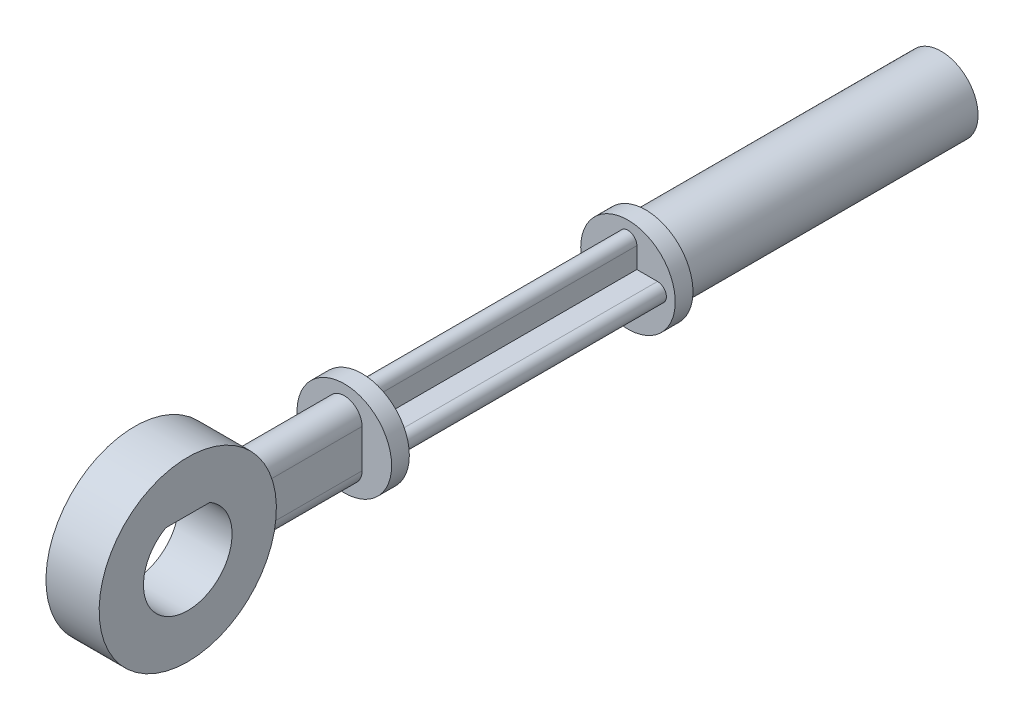
ISO-10303-21;
HEADER;
FILE_DESCRIPTION(('STEP AP214'),'2;1');
FILE_NAME('part.step','',(''),(''),'','','');
FILE_SCHEMA(('AUTOMOTIVE_DESIGN { 1 0 10303 214 1 1 1 1 }'));
ENDSEC;
DATA;
#1=APPLICATION_CONTEXT('core data for automotive mechanical design processes');
#2=APPLICATION_PROTOCOL_DEFINITION('international standard','automotive_design',2000,#1);
#3=PRODUCT_CONTEXT('',#1,'mechanical');
#4=PRODUCT('Part','Part','',(#3));
#5=PRODUCT_RELATED_PRODUCT_CATEGORY('part','',(#4));
#6=PRODUCT_DEFINITION_FORMATION('','',#4);
#7=PRODUCT_DEFINITION_CONTEXT('part definition',#1,'design');
#8=PRODUCT_DEFINITION('design','',#6,#7);
#9=PRODUCT_DEFINITION_SHAPE('','',#8);
#10=(LENGTH_UNIT() NAMED_UNIT(*) SI_UNIT(.MILLI.,.METRE.));
#11=(NAMED_UNIT(*) PLANE_ANGLE_UNIT() SI_UNIT($,.RADIAN.));
#12=(NAMED_UNIT(*) SI_UNIT($,.STERADIAN.) SOLID_ANGLE_UNIT());
#13=UNCERTAINTY_MEASURE_WITH_UNIT(LENGTH_MEASURE(1.E-05),#10,'distance_accuracy_value','');
#14=(GEOMETRIC_REPRESENTATION_CONTEXT(3) GLOBAL_UNCERTAINTY_ASSIGNED_CONTEXT((#13)) GLOBAL_UNIT_ASSIGNED_CONTEXT((#10,
#11,#12)) REPRESENTATION_CONTEXT('',''));
#15=CARTESIAN_POINT('',(0.,0.,0.));
#16=DIRECTION('',(0.,0.,1.));
#17=DIRECTION('',(1.,0.,0.));
#18=AXIS2_PLACEMENT_3D('',#15,#16,#17);
#19=CARTESIAN_POINT('',(0.,0.,-99.));
#20=DIRECTION('',(0.,0.,-1.));
#21=DIRECTION('',(-1.,0.,0.));
#22=AXIS2_PLACEMENT_3D('',#19,#20,#21);
#23=PLANE('',#22);
#24=CARTESIAN_POINT('',(0.,0.,-99.));
#25=DIRECTION('',(0.,0.,-1.));
#26=DIRECTION('',(-1.,0.,0.));
#27=AXIS2_PLACEMENT_3D('',#24,#25,#26);
#28=CIRCLE('',#27,16.);
#29=CARTESIAN_POINT('',(-16.,0.,-99.));
#30=VERTEX_POINT('',#29);
#31=EDGE_CURVE('E237',#30,#30,#28,.T.);
#32=ORIENTED_EDGE('',*,*,#31,.T.);
#33=EDGE_LOOP('',(#32));
#34=FACE_BOUND('',#33,.T.);
#35=CARTESIAN_POINT('',(0.,0.,-99.));
#36=DIRECTION('',(0.,0.,-1.));
#37=DIRECTION('',(-1.,0.,0.));
#38=AXIS2_PLACEMENT_3D('',#35,#36,#37);
#39=CIRCLE('',#38,12.5);
#40=CARTESIAN_POINT('',(-12.5,0.,-99.));
#41=VERTEX_POINT('',#40);
#42=EDGE_CURVE('E182',#41,#41,#39,.T.);
#43=ORIENTED_EDGE('',*,*,#42,.F.);
#44=EDGE_LOOP('',(#43));
#45=FACE_BOUND('',#44,.T.);
#46=ADVANCED_FACE('F36',(#34,#45),#23,.T.);
#47=CARTESIAN_POINT('',(0.,-6.5,92.7308492477241));
#48=DIRECTION('',(0.,0.,-1.));
#49=DIRECTION('',(-1.,0.,0.));
#50=AXIS2_PLACEMENT_3D('',#47,#48,#49);
#51=CYLINDRICAL_SURFACE('',#50,6.);
#52=CARTESIAN_POINT('',(-6.,-6.5,35.7126307087851));
#53=CARTESIAN_POINT('',(-6.00001683778245,-6.67468075228206,35.7513827899035));
#54=CARTESIAN_POINT('',(-5.99237280406724,-6.8489880717354,35.7917237801018));
#55=CARTESIAN_POINT('',(-5.96207767435946,-7.19557585346838,35.8751790597631));
#56=CARTESIAN_POINT('',(-5.93943067963163,-7.36785685657383,35.9182925884074));
#57=CARTESIAN_POINT('',(-5.87949365463989,-7.70892613761199,36.0068366464332));
#58=CARTESIAN_POINT('',(-5.84222793942425,-7.87771972785439,36.0522632199486));
#59=CARTESIAN_POINT('',(-5.75345581570317,-8.21098845699761,36.1450251746138));
#60=CARTESIAN_POINT('',(-5.70194864247199,-8.37546336347795,36.1923606581501));
#61=CARTESIAN_POINT('',(-5.58519716706877,-8.69888805621716,36.2883684528415));
#62=CARTESIAN_POINT('',(-5.51996442747945,-8.85784236260664,36.3370396089882));
#63=CARTESIAN_POINT('',(-5.37620421873952,-9.1694341204862,36.4351935063338));
#64=CARTESIAN_POINT('',(-5.29767188373591,-9.32206923447952,36.4846765385639));
#65=CARTESIAN_POINT('',(-5.12785042239082,-9.6200250633754,36.5838114174756));
#66=CARTESIAN_POINT('',(-5.03656053165549,-9.76534533928499,36.6334632740987));
#67=CARTESIAN_POINT('',(-4.84175083415795,-10.0478011118079,36.7322782976936));
#68=CARTESIAN_POINT('',(-4.73822677236185,-10.1849337356549,36.781441288155));
#69=CARTESIAN_POINT('',(-4.51716721019156,-10.4529780434153,36.8796147474127));
#70=CARTESIAN_POINT('',(-4.39937446066113,-10.5836876542726,36.9285982847973));
#71=CARTESIAN_POINT('',(-4.15234530538269,-10.8346310046475,37.0244961286581));
#72=CARTESIAN_POINT('',(-4.0231092857878,-10.95486509739,37.0714105048782));
#73=CARTESIAN_POINT('',(-3.75391275997439,-11.1839492732298,37.1623551029291));
#74=CARTESIAN_POINT('',(-3.61395004245452,-11.2927969980387,37.2063847265815));
#75=CARTESIAN_POINT('',(-3.3242357691165,-11.4980955891339,37.2906854851511));
#76=CARTESIAN_POINT('',(-3.17448871142096,-11.5945520923382,37.3309583267747));
#77=CARTESIAN_POINT('',(-2.87078464391185,-11.7714837508394,37.4057774073163));
#78=CARTESIAN_POINT('',(-2.71709124372377,-11.8523534892461,37.4404598327866));
#79=CARTESIAN_POINT('',(-2.40246071407756,-12.0007653142001,37.5047608710439));
#80=CARTESIAN_POINT('',(-2.24152699866434,-12.0683136030061,37.5343818395041));
#81=CARTESIAN_POINT('',(-1.91359644038432,-12.1893481973649,37.587882748261));
#82=CARTESIAN_POINT('',(-1.74660196775955,-12.2428399341293,37.6117649056302));
#83=CARTESIAN_POINT('',(-1.40783822847228,-12.3351351500465,37.6532084590827));
#84=CARTESIAN_POINT('',(-1.23606938442583,-12.3739399248378,37.6707704127083));
#85=CARTESIAN_POINT('',(-0.903621100762745,-12.4337667400527,37.6979409440212));
#86=CARTESIAN_POINT('',(-0.743201835135049,-12.4559956465904,37.7080878792075));
#87=CARTESIAN_POINT('',(-0.420830878069553,-12.4874137428258,37.7224487915005));
#88=CARTESIAN_POINT('',(-0.258879283040831,-12.496603747468,37.7266631393996));
#89=CARTESIAN_POINT('',(0.0652387444608811,-12.5018337900902,37.7290601610141));
#90=CARTESIAN_POINT('',(0.227405112738759,-12.4978771311422,37.7272443497944));
#91=CARTESIAN_POINT('',(0.550706527694207,-12.4768688901763,37.7176270079332));
#92=CARTESIAN_POINT('',(0.711841592864589,-12.459817543633,37.7098255849276));
#93=CARTESIAN_POINT('',(1.02365872177968,-12.4140237130942,37.6889654220295));
#94=CARTESIAN_POINT('',(1.17445482325386,-12.3859217222193,37.6761950492769));
#95=CARTESIAN_POINT('',(1.47302447587425,-12.3183874570156,37.6456821960013));
#96=CARTESIAN_POINT('',(1.62079702941187,-12.2789515056622,37.627938101923));
#97=CARTESIAN_POINT('',(1.91228800647656,-12.1891481682919,37.5878296912271));
#98=CARTESIAN_POINT('',(2.05600752773881,-12.138783774929,37.5654666395495));
#99=CARTESIAN_POINT('',(2.33863654755367,-12.0275541860307,37.5165207456575));
#100=CARTESIAN_POINT('',(2.47754419146611,-11.9666849945357,37.489936297959));
#101=CARTESIAN_POINT('',(2.7543570847781,-11.8327240034637,37.4320450664053));
#102=CARTESIAN_POINT('',(2.89206887161332,-11.7592879275982,37.4006087892597));
#103=CARTESIAN_POINT('',(3.16076574160381,-11.6023332374764,37.3342606440919));
#104=CARTESIAN_POINT('',(3.29174833038958,-11.5188109223605,37.2993475011612));
#105=CARTESIAN_POINT('',(3.67354374120753,-11.2540353473667,37.1902345367156));
#106=CARTESIAN_POINT('',(3.91339510347169,-11.0584804009261,37.111620175261));
#107=CARTESIAN_POINT('',(4.37696518912197,-10.617380967419,36.9405705041942));
#108=CARTESIAN_POINT('',(4.59781140182168,-10.3690729990156,36.8475316442243));
#109=CARTESIAN_POINT('',(4.99540001380377,-9.8399695565974,36.6582686648298));
#110=CARTESIAN_POINT('',(5.17211297195058,-9.55915257774347,36.5620424673564));
#111=CARTESIAN_POINT('',(5.40510638118058,-9.11064256727742,36.4163864060729));
#112=CARTESIAN_POINT('',(5.47889311474076,-8.95201500010147,36.3662769031273));
#113=CARTESIAN_POINT('',(5.61243633291475,-8.62864118787876,36.2671777237326));
#114=CARTESIAN_POINT('',(5.6721977695104,-8.46389712627992,36.2181876575695));
#115=CARTESIAN_POINT('',(5.77712565048855,-8.12956823072953,36.1219744345669));
#116=CARTESIAN_POINT('',(5.82230945735638,-7.95998941922634,36.0747492354524));
#117=CARTESIAN_POINT('',(5.8977186838957,-7.61701279019291,35.9825462868492));
#118=CARTESIAN_POINT('',(5.92795163238172,-7.44361694085584,35.9375674164552));
#119=CARTESIAN_POINT('',(5.96696182779359,-7.14173021115617,35.8621744633888));
#120=CARTESIAN_POINT('',(5.97933805586961,-7.01385157516138,35.8311260498781));
#121=CARTESIAN_POINT('',(5.99585278927128,-6.75738395005319,35.7706456211464));
#122=CARTESIAN_POINT('',(6.00000340400173,-6.62879628502926,35.7412112919483));
#123=CARTESIAN_POINT('',(6.,-6.5,35.7126307087851));
#124=B_SPLINE_CURVE_WITH_KNOTS('',3,(#52,#53,#54,#55,#56,#57,#58,#59,#60,#61,#62,#63,#64,#65,
#66,#67,#68,#69,#70,#71,#72,#73,#74,#75,#76,#77,#78,#79,#80,#81,#82,#83,#84,#85,#86,#87,#88,#89,
#90,#91,#92,#93,#94,#95,#96,#97,#98,#99,#100,#101,#102,#103,#104,#105,#106,#107,#108,#109,#110,
#111,#112,#113,#114,#115,#116,#117,#118,#119,#120,#121,#122,#123),.UNSPECIFIED.,.F.,.F.,(4,2,2,
2,2,2,2,2,2,2,2,2,2,2,2,2,2,2,2,2,2,2,2,2,2,2,2,2,2,2,2,2,2,2,2,4),(0.,0.536582696290644,
1.07301877085063,1.60856635872044,2.14414270955804,2.67926967795391,3.21459285508804,
3.74994812091762,4.28549013387307,4.83276333273559,5.38001807089781,5.92738593028416,
6.47450389688051,7.00510328638206,7.53545505084579,8.06560159413498,8.59570135862397,
9.08188575218811,9.56803975740318,10.0540716266728,10.540094756106,11.0013345217406,
11.4627240945037,11.923987479037,12.3854267135929,12.8625019765631,13.3397528237065,
14.2936127461333,15.3245982361516,16.3562696667472,16.9016825190223,17.4469025089587,
17.9914707040763,18.5357643906373,18.9320335742627,19.3277189522879),.UNSPECIFIED.);
#125=CARTESIAN_POINT('',(-6.,-6.5,35.7126307087851));
#126=VERTEX_POINT('',#125);
#127=CARTESIAN_POINT('',(6.,-6.5,35.7126307087851));
#128=VERTEX_POINT('',#127);
#129=EDGE_CURVE('E227',#126,#128,#124,.T.);
#130=ORIENTED_EDGE('',*,*,#129,.F.);
#131=DIRECTION('',(0.,0.,-1.));
#132=VECTOR('',#131,1.);
#133=CARTESIAN_POINT('',(-6.,-6.5,92.7308492477241));
#134=LINE('',#133,#132);
#135=CARTESIAN_POINT('',(-6.,-6.5,3.));
#136=VERTEX_POINT('',#135);
#137=EDGE_CURVE('E429',#126,#136,#134,.T.);
#138=ORIENTED_EDGE('',*,*,#137,.T.);
#139=CARTESIAN_POINT('',(0.,-6.5,3.));
#140=DIRECTION('',(0.,0.,1.));
#141=DIRECTION('',(-1.,0.,0.));
#142=AXIS2_PLACEMENT_3D('',#139,#140,#141);
#143=CIRCLE('',#142,6.);
#144=CARTESIAN_POINT('',(6.,-6.5,3.));
#145=VERTEX_POINT('',#144);
#146=EDGE_CURVE('E446',#136,#145,#143,.T.);
#147=ORIENTED_EDGE('',*,*,#146,.T.);
#148=DIRECTION('',(0.,0.,-1.));
#149=VECTOR('',#148,1.);
#150=CARTESIAN_POINT('',(6.,-6.5,92.7308492477241));
#151=LINE('',#150,#149);
#152=EDGE_CURVE('E445',#128,#145,#151,.T.);
#153=ORIENTED_EDGE('',*,*,#152,.F.);
#154=EDGE_LOOP('',(#130,#138,#147,#153));
#155=FACE_BOUND('',#154,.T.);
#156=ADVANCED_FACE('F239',(#155),#51,.T.);
#157=CARTESIAN_POINT('',(6.,6.5,92.7308492477241));
#158=DIRECTION('',(-1.,0.,0.));
#159=DIRECTION('',(0.,0.,1.));
#160=AXIS2_PLACEMENT_3D('',#157,#158,#159);
#161=PLANE('',#160);
#162=CARTESIAN_POINT('',(6.,0.,65.));
#163=DIRECTION('',(-1.,0.,0.));
#164=DIRECTION('',(0.,0.,1.));
#165=AXIS2_PLACEMENT_3D('',#162,#163,#164);
#166=CIRCLE('',#165,30.);
#167=CARTESIAN_POINT('',(6.,6.5,35.7126307087851));
#168=VERTEX_POINT('',#167);
#169=EDGE_CURVE('E210',#128,#168,#166,.F.);
#170=ORIENTED_EDGE('',*,*,#169,.F.);
#171=ORIENTED_EDGE('',*,*,#152,.T.);
#172=DIRECTION('',(0.,1.,0.));
#173=VECTOR('',#172,1.);
#174=CARTESIAN_POINT('',(6.,6.5,3.));
#175=LINE('',#174,#173);
#176=CARTESIAN_POINT('',(6.,6.5,3.));
#177=VERTEX_POINT('',#176);
#178=EDGE_CURVE('E441',#145,#177,#175,.T.);
#179=ORIENTED_EDGE('',*,*,#178,.T.);
#180=DIRECTION('',(0.,0.,-1.));
#181=VECTOR('',#180,1.);
#182=CARTESIAN_POINT('',(6.,6.5,92.7308492477241));
#183=LINE('',#182,#181);
#184=EDGE_CURVE('E440',#168,#177,#183,.T.);
#185=ORIENTED_EDGE('',*,*,#184,.F.);
#186=EDGE_LOOP('',(#170,#171,#179,#185));
#187=FACE_BOUND('',#186,.T.);
#188=ADVANCED_FACE('F243',(#187),#161,.F.);
#189=CARTESIAN_POINT('',(0.,6.5,92.7308492477241));
#190=DIRECTION('',(0.,0.,-1.));
#191=DIRECTION('',(-1.,0.,0.));
#192=AXIS2_PLACEMENT_3D('',#189,#190,#191);
#193=CYLINDRICAL_SURFACE('',#192,6.);
#194=CARTESIAN_POINT('',(6.,6.5,35.7126307087851));
#195=CARTESIAN_POINT('',(6.00001683778245,6.67468075228206,35.7513827899035));
#196=CARTESIAN_POINT('',(5.99237280406724,6.8489880717354,35.7917237801018));
#197=CARTESIAN_POINT('',(5.96207767435946,7.19557585346838,35.8751790597631));
#198=CARTESIAN_POINT('',(5.93943067963163,7.36785685657383,35.9182925884074));
#199=CARTESIAN_POINT('',(5.87949365463989,7.70892613761199,36.0068366464332));
#200=CARTESIAN_POINT('',(5.84222793942425,7.87771972785439,36.0522632199486));
#201=CARTESIAN_POINT('',(5.75345581570317,8.21098845699761,36.1450251746138));
#202=CARTESIAN_POINT('',(5.70194864247199,8.37546336347795,36.1923606581501));
#203=CARTESIAN_POINT('',(5.58519716706877,8.69888805621716,36.2883684528415));
#204=CARTESIAN_POINT('',(5.51996442747945,8.85784236260665,36.3370396089882));
#205=CARTESIAN_POINT('',(5.37620421873952,9.1694341204862,36.4351935063338));
#206=CARTESIAN_POINT('',(5.29767188373591,9.32206923447952,36.4846765385639));
#207=CARTESIAN_POINT('',(5.12785042239082,9.62002506337541,36.5838114174756));
#208=CARTESIAN_POINT('',(5.03656053165549,9.76534533928499,36.6334632740987));
#209=CARTESIAN_POINT('',(4.84175083415795,10.0478011118079,36.7322782976936));
#210=CARTESIAN_POINT('',(4.73822677236185,10.1849337356549,36.781441288155));
#211=CARTESIAN_POINT('',(4.51716721019156,10.4529780434153,36.8796147474127));
#212=CARTESIAN_POINT('',(4.39937446066113,10.5836876542726,36.9285982847973));
#213=CARTESIAN_POINT('',(4.15234530538268,10.8346310046475,37.0244961286581));
#214=CARTESIAN_POINT('',(4.0231092857878,10.95486509739,37.0714105048782));
#215=CARTESIAN_POINT('',(3.75391275997439,11.1839492732298,37.1623551029291));
#216=CARTESIAN_POINT('',(3.61395004245453,11.2927969980387,37.2063847265815));
#217=CARTESIAN_POINT('',(3.3242357691165,11.498095589134,37.2906854851511));
#218=CARTESIAN_POINT('',(3.17448871142096,11.5945520923382,37.3309583267747));
#219=CARTESIAN_POINT('',(2.87078464391185,11.7714837508394,37.4057774073163));
#220=CARTESIAN_POINT('',(2.71709124372377,11.8523534892461,37.4404598327866));
#221=CARTESIAN_POINT('',(2.40246071407756,12.0007653142001,37.5047608710439));
#222=CARTESIAN_POINT('',(2.24152699866434,12.0683136030061,37.5343818395041));
#223=CARTESIAN_POINT('',(1.91359644038433,12.1893481973649,37.587882748261));
#224=CARTESIAN_POINT('',(1.74660196775955,12.2428399341293,37.6117649056302));
#225=CARTESIAN_POINT('',(1.40783822847229,12.3351351500465,37.6532084590827));
#226=CARTESIAN_POINT('',(1.23606938442584,12.3739399248378,37.6707704127083));
#227=CARTESIAN_POINT('',(0.903621100762745,12.4337667400527,37.6979409440212));
#228=CARTESIAN_POINT('',(0.743201835135049,12.4559956465904,37.7080878792075));
#229=CARTESIAN_POINT('',(0.420830878069554,12.4874137428258,37.7224487915005));
#230=CARTESIAN_POINT('',(0.258879283040831,12.496603747468,37.7266631393996));
#231=CARTESIAN_POINT('',(-0.0652387444608806,12.5018337900902,37.7290601610141));
#232=CARTESIAN_POINT('',(-0.227405112738759,12.4978771311422,37.7272443497944));
#233=CARTESIAN_POINT('',(-0.550706527694206,12.4768688901763,37.7176270079332));
#234=CARTESIAN_POINT('',(-0.711841592864588,12.459817543633,37.7098255849276));
#235=CARTESIAN_POINT('',(-1.02365872177968,12.4140237130942,37.6889654220295));
#236=CARTESIAN_POINT('',(-1.17445482325386,12.3859217222193,37.6761950492769));
#237=CARTESIAN_POINT('',(-1.47302447587425,12.3183874570156,37.6456821960013));
#238=CARTESIAN_POINT('',(-1.62079702941187,12.2789515056622,37.627938101923));
#239=CARTESIAN_POINT('',(-1.91228800647656,12.1891481682919,37.5878296912271));
#240=CARTESIAN_POINT('',(-2.05600752773881,12.138783774929,37.5654666395495));
#241=CARTESIAN_POINT('',(-2.33863654755366,12.0275541860307,37.5165207456575));
#242=CARTESIAN_POINT('',(-2.4775441914661,11.9666849945357,37.489936297959));
#243=CARTESIAN_POINT('',(-2.7543570847781,11.8327240034637,37.4320450664053));
#244=CARTESIAN_POINT('',(-2.89206887161332,11.7592879275982,37.4006087892597));
#245=CARTESIAN_POINT('',(-3.16076574160381,11.6023332374764,37.3342606440919));
#246=CARTESIAN_POINT('',(-3.29174833038958,11.5188109223605,37.2993475011612));
#247=CARTESIAN_POINT('',(-3.67354374120753,11.2540353473667,37.1902345367156));
#248=CARTESIAN_POINT('',(-3.91339510347169,11.0584804009261,37.111620175261));
#249=CARTESIAN_POINT('',(-4.37696518912197,10.617380967419,36.9405705041942));
#250=CARTESIAN_POINT('',(-4.59781140182167,10.3690729990156,36.8475316442243));
#251=CARTESIAN_POINT('',(-4.99540001380377,9.8399695565974,36.6582686648298));
#252=CARTESIAN_POINT('',(-5.17211297195058,9.55915257774347,36.5620424673564));
#253=CARTESIAN_POINT('',(-5.40510638118058,9.11064256727742,36.4163864060729));
#254=CARTESIAN_POINT('',(-5.47889311474076,8.95201500010147,36.3662769031273));
#255=CARTESIAN_POINT('',(-5.61243633291475,8.62864118787877,36.2671777237326));
#256=CARTESIAN_POINT('',(-5.6721977695104,8.46389712627993,36.2181876575695));
#257=CARTESIAN_POINT('',(-5.77712565048855,8.12956823072953,36.1219744345669));
#258=CARTESIAN_POINT('',(-5.82230945735638,7.95998941922634,36.0747492354524));
#259=CARTESIAN_POINT('',(-5.89771868389569,7.61701279019291,35.9825462868492));
#260=CARTESIAN_POINT('',(-5.92795163238172,7.44361694085584,35.9375674164552));
#261=CARTESIAN_POINT('',(-5.96696182779359,7.14173021115617,35.8621744633888));
#262=CARTESIAN_POINT('',(-5.97933805586961,7.01385157516138,35.8311260498781));
#263=CARTESIAN_POINT('',(-5.99585278927128,6.75738395005319,35.7706456211464));
#264=CARTESIAN_POINT('',(-6.00000340400172,6.62879628502927,35.7412112919483));
#265=CARTESIAN_POINT('',(-6.,6.5,35.7126307087851));
#266=B_SPLINE_CURVE_WITH_KNOTS('',3,(#194,#195,#196,#197,#198,#199,#200,#201,#202,#203,#204,
#205,#206,#207,#208,#209,#210,#211,#212,#213,#214,#215,#216,#217,#218,#219,#220,#221,#222,#223,
#224,#225,#226,#227,#228,#229,#230,#231,#232,#233,#234,#235,#236,#237,#238,#239,#240,#241,#242,
#243,#244,#245,#246,#247,#248,#249,#250,#251,#252,#253,#254,#255,#256,#257,#258,#259,#260,#261,
#262,#263,#264,#265),.UNSPECIFIED.,.F.,.F.,(4,2,2,2,2,2,2,2,2,2,2,2,2,2,2,2,2,2,2,2,2,2,2,2,2,2,
2,2,2,2,2,2,2,2,2,4),(0.,0.536582696290645,1.07301877085063,1.60856635872044,2.14414270955804,
2.67926967795391,3.21459285508804,3.74994812091762,4.28549013387307,4.83276333273559,
5.38001807089781,5.92738593028416,6.47450389688051,7.00510328638206,7.53545505084579,
8.06560159413498,8.59570135862397,9.08188575218811,9.56803975740318,10.0540716266728,
10.540094756106,11.0013345217406,11.4627240945037,11.923987479037,12.3854267135929,
12.8625019765631,13.3397528237064,14.2936127461332,15.3245982361516,16.3562696667472,
16.9016825190223,17.4469025089587,17.9914707040763,18.5357643906373,18.9320335742627,
19.3277189522879),.UNSPECIFIED.);
#267=CARTESIAN_POINT('',(-6.,6.5,35.7126307087851));
#268=VERTEX_POINT('',#267);
#269=EDGE_CURVE('E200',#168,#268,#266,.T.);
#270=ORIENTED_EDGE('',*,*,#269,.F.);
#271=ORIENTED_EDGE('',*,*,#184,.T.);
#272=CARTESIAN_POINT('',(0.,6.5,3.));
#273=DIRECTION('',(0.,0.,1.));
#274=DIRECTION('',(-1.,0.,0.));
#275=AXIS2_PLACEMENT_3D('',#272,#273,#274);
#276=CIRCLE('',#275,6.);
#277=CARTESIAN_POINT('',(-6.,6.5,3.));
#278=VERTEX_POINT('',#277);
#279=EDGE_CURVE('E436',#177,#278,#276,.T.);
#280=ORIENTED_EDGE('',*,*,#279,.T.);
#281=DIRECTION('',(0.,0.,-1.));
#282=VECTOR('',#281,1.);
#283=CARTESIAN_POINT('',(-6.,6.5,92.7308492477241));
#284=LINE('',#283,#282);
#285=EDGE_CURVE('E435',#268,#278,#284,.T.);
#286=ORIENTED_EDGE('',*,*,#285,.F.);
#287=EDGE_LOOP('',(#270,#271,#280,#286));
#288=FACE_BOUND('',#287,.T.);
#289=ADVANCED_FACE('F212',(#288),#193,.T.);
#290=CARTESIAN_POINT('',(-6.,-6.5,92.7308492477241));
#291=DIRECTION('',(1.,0.,0.));
#292=DIRECTION('',(0.,0.,-1.));
#293=AXIS2_PLACEMENT_3D('',#290,#291,#292);
#294=PLANE('',#293);
#295=CARTESIAN_POINT('',(-6.,0.,65.));
#296=DIRECTION('',(1.,0.,0.));
#297=DIRECTION('',(0.,0.,-1.));
#298=AXIS2_PLACEMENT_3D('',#295,#296,#297);
#299=CIRCLE('',#298,30.);
#300=EDGE_CURVE('E11',#268,#126,#299,.F.);
#301=ORIENTED_EDGE('',*,*,#300,.F.);
#302=ORIENTED_EDGE('',*,*,#285,.T.);
#303=DIRECTION('',(0.,-1.,0.));
#304=VECTOR('',#303,1.);
#305=CARTESIAN_POINT('',(-6.,-6.5,3.));
#306=LINE('',#305,#304);
#307=EDGE_CURVE('E430',#278,#136,#306,.T.);
#308=ORIENTED_EDGE('',*,*,#307,.T.);
#309=ORIENTED_EDGE('',*,*,#137,.F.);
#310=EDGE_LOOP('',(#301,#302,#308,#309));
#311=FACE_BOUND('',#310,.T.);
#312=ADVANCED_FACE('F250',(#311),#294,.F.);
#313=CARTESIAN_POINT('',(0.,0.,-3.));
#314=DIRECTION('',(0.,0.,1.));
#315=DIRECTION('',(1.,0.,0.));
#316=AXIS2_PLACEMENT_3D('',#313,#314,#315);
#317=PLANE('',#316);
#318=CARTESIAN_POINT('',(0.,0.,-3.));
#319=DIRECTION('',(0.,0.,1.));
#320=DIRECTION('',(1.,0.,0.));
#321=AXIS2_PLACEMENT_3D('',#318,#319,#320);
#322=CIRCLE('',#321,16.);
#323=CARTESIAN_POINT('',(16.,0.,-3.));
#324=VERTEX_POINT('',#323);
#325=EDGE_CURVE('E434',#324,#324,#322,.T.);
#326=ORIENTED_EDGE('',*,*,#325,.F.);
#327=EDGE_LOOP('',(#326));
#328=FACE_BOUND('',#327,.T.);
#329=DIRECTION('',(1.,0.,0.));
#330=VECTOR('',#329,1.);
#331=CARTESIAN_POINT('',(10.,3.,-3.));
#332=LINE('',#331,#330);
#333=CARTESIAN_POINT('',(3.,3.,-3.));
#334=VERTEX_POINT('',#333);
#335=CARTESIAN_POINT('',(10.,3.,-3.));
#336=VERTEX_POINT('',#335);
#337=EDGE_CURVE('E326',#334,#336,#332,.T.);
#338=ORIENTED_EDGE('',*,*,#337,.F.);
#339=DIRECTION('',(0.,-1.,0.));
#340=VECTOR('',#339,1.);
#341=CARTESIAN_POINT('',(3.,3.,-3.));
#342=LINE('',#341,#340);
#343=CARTESIAN_POINT('',(3.,10.,-3.));
#344=VERTEX_POINT('',#343);
#345=EDGE_CURVE('E381',#344,#334,#342,.T.);
#346=ORIENTED_EDGE('',*,*,#345,.F.);
#347=CARTESIAN_POINT('',(0.,10.,-3.));
#348=DIRECTION('',(0.,0.,-1.));
#349=DIRECTION('',(1.,0.,0.));
#350=AXIS2_PLACEMENT_3D('',#347,#348,#349);
#351=CIRCLE('',#350,3.);
#352=CARTESIAN_POINT('',(-3.,10.,-3.));
#353=VERTEX_POINT('',#352);
#354=EDGE_CURVE('E377',#353,#344,#351,.T.);
#355=ORIENTED_EDGE('',*,*,#354,.F.);
#356=DIRECTION('',(0.,1.,0.));
#357=VECTOR('',#356,1.);
#358=CARTESIAN_POINT('',(-3.,10.,-3.));
#359=LINE('',#358,#357);
#360=CARTESIAN_POINT('',(-3.,3.,-3.));
#361=VERTEX_POINT('',#360);
#362=EDGE_CURVE('E373',#361,#353,#359,.T.);
#363=ORIENTED_EDGE('',*,*,#362,.F.);
#364=DIRECTION('',(1.,0.,0.));
#365=VECTOR('',#364,1.);
#366=CARTESIAN_POINT('',(-3.,3.,-3.));
#367=LINE('',#366,#365);
#368=CARTESIAN_POINT('',(-10.,3.,-3.));
#369=VERTEX_POINT('',#368);
#370=EDGE_CURVE('E369',#369,#361,#367,.T.);
#371=ORIENTED_EDGE('',*,*,#370,.F.);
#372=CARTESIAN_POINT('',(-10.,0.,-3.));
#373=DIRECTION('',(0.,0.,-1.));
#374=DIRECTION('',(1.,0.,0.));
#375=AXIS2_PLACEMENT_3D('',#372,#373,#374);
#376=CIRCLE('',#375,3.);
#377=CARTESIAN_POINT('',(-10.,-3.,-3.));
#378=VERTEX_POINT('',#377);
#379=EDGE_CURVE('E365',#378,#369,#376,.T.);
#380=ORIENTED_EDGE('',*,*,#379,.F.);
#381=DIRECTION('',(-1.,0.,0.));
#382=VECTOR('',#381,1.);
#383=CARTESIAN_POINT('',(-10.,-3.,-3.));
#384=LINE('',#383,#382);
#385=CARTESIAN_POINT('',(-3.,-3.,-3.));
#386=VERTEX_POINT('',#385);
#387=EDGE_CURVE('E361',#386,#378,#384,.T.);
#388=ORIENTED_EDGE('',*,*,#387,.F.);
#389=DIRECTION('',(0.,1.,0.));
#390=VECTOR('',#389,1.);
#391=CARTESIAN_POINT('',(-3.,-3.,-3.));
#392=LINE('',#391,#390);
#393=CARTESIAN_POINT('',(-3.,-10.,-3.));
#394=VERTEX_POINT('',#393);
#395=EDGE_CURVE('E357',#394,#386,#392,.T.);
#396=ORIENTED_EDGE('',*,*,#395,.F.);
#397=CARTESIAN_POINT('',(0.,-10.,-3.));
#398=DIRECTION('',(0.,0.,-1.));
#399=DIRECTION('',(1.,0.,0.));
#400=AXIS2_PLACEMENT_3D('',#397,#398,#399);
#401=CIRCLE('',#400,3.);
#402=CARTESIAN_POINT('',(3.,-10.,-3.));
#403=VERTEX_POINT('',#402);
#404=EDGE_CURVE('E353',#403,#394,#401,.T.);
#405=ORIENTED_EDGE('',*,*,#404,.F.);
#406=DIRECTION('',(0.,-1.,0.));
#407=VECTOR('',#406,1.);
#408=CARTESIAN_POINT('',(3.,-10.,-3.));
#409=LINE('',#408,#407);
#410=CARTESIAN_POINT('',(3.,-3.,-3.));
#411=VERTEX_POINT('',#410);
#412=EDGE_CURVE('E349',#411,#403,#409,.T.);
#413=ORIENTED_EDGE('',*,*,#412,.F.);
#414=DIRECTION('',(-1.,0.,0.));
#415=VECTOR('',#414,1.);
#416=CARTESIAN_POINT('',(3.,-3.,-3.));
#417=LINE('',#416,#415);
#418=CARTESIAN_POINT('',(10.,-3.,-3.));
#419=VERTEX_POINT('',#418);
#420=EDGE_CURVE('E340',#419,#411,#417,.T.);
#421=ORIENTED_EDGE('',*,*,#420,.F.);
#422=CARTESIAN_POINT('',(10.,0.,-3.));
#423=DIRECTION('',(0.,0.,-1.));
#424=DIRECTION('',(1.,0.,0.));
#425=AXIS2_PLACEMENT_3D('',#422,#423,#424);
#426=CIRCLE('',#425,3.);
#427=EDGE_CURVE('E334',#336,#419,#426,.T.);
#428=ORIENTED_EDGE('',*,*,#427,.F.);
#429=EDGE_LOOP('',(#338,#346,#355,#363,#371,#380,#388,#396,#405,#413,#421,#428));
#430=FACE_BOUND('',#429,.T.);
#431=ADVANCED_FACE('F247',(#328,#430),#317,.F.);
#432=CARTESIAN_POINT('',(0.,0.,3.));
#433=DIRECTION('',(0.,0.,1.));
#434=DIRECTION('',(1.,0.,0.));
#435=AXIS2_PLACEMENT_3D('',#432,#433,#434);
#436=PLANE('',#435);
#437=CARTESIAN_POINT('',(0.,0.,3.));
#438=DIRECTION('',(0.,0.,1.));
#439=DIRECTION('',(1.,0.,0.));
#440=AXIS2_PLACEMENT_3D('',#437,#438,#439);
#441=CIRCLE('',#440,16.);
#442=CARTESIAN_POINT('',(16.,0.,3.));
#443=VERTEX_POINT('',#442);
#444=EDGE_CURVE('E45',#443,#443,#441,.T.);
#445=ORIENTED_EDGE('',*,*,#444,.T.);
#446=EDGE_LOOP('',(#445));
#447=FACE_BOUND('',#446,.T.);
#448=ORIENTED_EDGE('',*,*,#178,.F.);
#449=ORIENTED_EDGE('',*,*,#146,.F.);
#450=ORIENTED_EDGE('',*,*,#307,.F.);
#451=ORIENTED_EDGE('',*,*,#279,.F.);
#452=EDGE_LOOP('',(#448,#449,#450,#451));
#453=FACE_BOUND('',#452,.T.);
#454=ADVANCED_FACE('F245',(#447,#453),#436,.T.);
#455=CARTESIAN_POINT('',(0.,0.,3.));
#456=DIRECTION('',(0.,0.,-1.));
#457=DIRECTION('',(-1.,0.,0.));
#458=AXIS2_PLACEMENT_3D('',#455,#456,#457);
#459=CYLINDRICAL_SURFACE('',#458,16.);
#460=ORIENTED_EDGE('',*,*,#444,.F.);
#461=EDGE_LOOP('',(#460));
#462=FACE_BOUND('',#461,.T.);
#463=ORIENTED_EDGE('',*,*,#325,.T.);
#464=EDGE_LOOP('',(#463));
#465=FACE_BOUND('',#464,.T.);
#466=ADVANCED_FACE('F38',(#462,#465),#459,.T.);
#467=CARTESIAN_POINT('',(10.,3.,-93.));
#468=DIRECTION('',(0.,-1.,0.));
#469=DIRECTION('',(0.,0.,-1.));
#470=AXIS2_PLACEMENT_3D('',#467,#468,#469);
#471=PLANE('',#470);
#472=ORIENTED_EDGE('',*,*,#337,.T.);
#473=DIRECTION('',(0.,0.,1.));
#474=VECTOR('',#473,1.);
#475=CARTESIAN_POINT('',(10.,3.,-93.));
#476=LINE('',#475,#474);
#477=CARTESIAN_POINT('',(10.,3.,-93.));
#478=VERTEX_POINT('',#477);
#479=EDGE_CURVE('E328',#478,#336,#476,.T.);
#480=ORIENTED_EDGE('',*,*,#479,.F.);
#481=DIRECTION('',(1.,0.,0.));
#482=VECTOR('',#481,1.);
#483=CARTESIAN_POINT('',(10.,3.,-93.));
#484=LINE('',#483,#482);
#485=CARTESIAN_POINT('',(3.,3.,-93.));
#486=VERTEX_POINT('',#485);
#487=EDGE_CURVE('E384',#486,#478,#484,.T.);
#488=ORIENTED_EDGE('',*,*,#487,.F.);
#489=DIRECTION('',(0.,0.,1.));
#490=VECTOR('',#489,1.);
#491=CARTESIAN_POINT('',(3.,3.,-93.));
#492=LINE('',#491,#490);
#493=EDGE_CURVE('E331',#486,#334,#492,.T.);
#494=ORIENTED_EDGE('',*,*,#493,.T.);
#495=EDGE_LOOP('',(#472,#480,#488,#494));
#496=FACE_BOUND('',#495,.T.);
#497=ADVANCED_FACE('F315',(#496),#471,.F.);
#498=CARTESIAN_POINT('',(10.,0.,-93.));
#499=DIRECTION('',(0.,0.,1.));
#500=DIRECTION('',(1.,0.,0.));
#501=AXIS2_PLACEMENT_3D('',#498,#499,#500);
#502=CYLINDRICAL_SURFACE('',#501,3.);
#503=ORIENTED_EDGE('',*,*,#427,.T.);
#504=DIRECTION('',(0.,0.,1.));
#505=VECTOR('',#504,1.);
#506=CARTESIAN_POINT('',(10.,-3.,-93.));
#507=LINE('',#506,#505);
#508=CARTESIAN_POINT('',(10.,-3.,-93.));
#509=VERTEX_POINT('',#508);
#510=EDGE_CURVE('E423',#509,#419,#507,.T.);
#511=ORIENTED_EDGE('',*,*,#510,.F.);
#512=CARTESIAN_POINT('',(10.,0.,-93.));
#513=DIRECTION('',(0.,0.,-1.));
#514=DIRECTION('',(1.,0.,0.));
#515=AXIS2_PLACEMENT_3D('',#512,#513,#514);
#516=CIRCLE('',#515,3.);
#517=EDGE_CURVE('E532',#478,#509,#516,.T.);
#518=ORIENTED_EDGE('',*,*,#517,.F.);
#519=ORIENTED_EDGE('',*,*,#479,.T.);
#520=EDGE_LOOP('',(#503,#511,#518,#519));
#521=FACE_BOUND('',#520,.T.);
#522=ADVANCED_FACE('F311',(#521),#502,.T.);
#523=CARTESIAN_POINT('',(3.,-3.,-93.));
#524=DIRECTION('',(0.,1.,0.));
#525=DIRECTION('',(0.,0.,1.));
#526=AXIS2_PLACEMENT_3D('',#523,#524,#525);
#527=PLANE('',#526);
#528=ORIENTED_EDGE('',*,*,#420,.T.);
#529=DIRECTION('',(0.,0.,1.));
#530=VECTOR('',#529,1.);
#531=CARTESIAN_POINT('',(3.,-3.,-93.));
#532=LINE('',#531,#530);
#533=CARTESIAN_POINT('',(3.,-3.,-93.));
#534=VERTEX_POINT('',#533);
#535=EDGE_CURVE('E419',#534,#411,#532,.T.);
#536=ORIENTED_EDGE('',*,*,#535,.F.);
#537=DIRECTION('',(-1.,0.,0.));
#538=VECTOR('',#537,1.);
#539=CARTESIAN_POINT('',(3.,-3.,-93.));
#540=LINE('',#539,#538);
#541=EDGE_CURVE('E527',#509,#534,#540,.T.);
#542=ORIENTED_EDGE('',*,*,#541,.F.);
#543=ORIENTED_EDGE('',*,*,#510,.T.);
#544=EDGE_LOOP('',(#528,#536,#542,#543));
#545=FACE_BOUND('',#544,.T.);
#546=ADVANCED_FACE('F307',(#545),#527,.F.);
#547=CARTESIAN_POINT('',(3.,-10.,-93.));
#548=DIRECTION('',(-1.,0.,0.));
#549=DIRECTION('',(0.,0.,1.));
#550=AXIS2_PLACEMENT_3D('',#547,#548,#549);
#551=PLANE('',#550);
#552=ORIENTED_EDGE('',*,*,#412,.T.);
#553=DIRECTION('',(0.,0.,1.));
#554=VECTOR('',#553,1.);
#555=CARTESIAN_POINT('',(3.,-10.,-93.));
#556=LINE('',#555,#554);
#557=CARTESIAN_POINT('',(3.,-10.,-93.));
#558=VERTEX_POINT('',#557);
#559=EDGE_CURVE('E415',#558,#403,#556,.T.);
#560=ORIENTED_EDGE('',*,*,#559,.F.);
#561=DIRECTION('',(0.,-1.,0.));
#562=VECTOR('',#561,1.);
#563=CARTESIAN_POINT('',(3.,-10.,-93.));
#564=LINE('',#563,#562);
#565=EDGE_CURVE('E522',#534,#558,#564,.T.);
#566=ORIENTED_EDGE('',*,*,#565,.F.);
#567=ORIENTED_EDGE('',*,*,#535,.T.);
#568=EDGE_LOOP('',(#552,#560,#566,#567));
#569=FACE_BOUND('',#568,.T.);
#570=ADVANCED_FACE('F303',(#569),#551,.F.);
#571=CARTESIAN_POINT('',(0.,-10.,-93.));
#572=DIRECTION('',(0.,0.,1.));
#573=DIRECTION('',(1.,0.,0.));
#574=AXIS2_PLACEMENT_3D('',#571,#572,#573);
#575=CYLINDRICAL_SURFACE('',#574,3.);
#576=ORIENTED_EDGE('',*,*,#404,.T.);
#577=DIRECTION('',(0.,0.,1.));
#578=VECTOR('',#577,1.);
#579=CARTESIAN_POINT('',(-3.,-10.,-93.));
#580=LINE('',#579,#578);
#581=CARTESIAN_POINT('',(-3.,-10.,-93.));
#582=VERTEX_POINT('',#581);
#583=EDGE_CURVE('E411',#582,#394,#580,.T.);
#584=ORIENTED_EDGE('',*,*,#583,.F.);
#585=CARTESIAN_POINT('',(0.,-10.,-93.));
#586=DIRECTION('',(0.,0.,-1.));
#587=DIRECTION('',(1.,0.,0.));
#588=AXIS2_PLACEMENT_3D('',#585,#586,#587);
#589=CIRCLE('',#588,3.);
#590=EDGE_CURVE('E517',#558,#582,#589,.T.);
#591=ORIENTED_EDGE('',*,*,#590,.F.);
#592=ORIENTED_EDGE('',*,*,#559,.T.);
#593=EDGE_LOOP('',(#576,#584,#591,#592));
#594=FACE_BOUND('',#593,.T.);
#595=ADVANCED_FACE('F299',(#594),#575,.T.);
#596=CARTESIAN_POINT('',(-3.,-3.,-93.));
#597=DIRECTION('',(1.,0.,0.));
#598=DIRECTION('',(0.,1.,0.));
#599=AXIS2_PLACEMENT_3D('',#596,#597,#598);
#600=PLANE('',#599);
#601=ORIENTED_EDGE('',*,*,#395,.T.);
#602=DIRECTION('',(0.,0.,1.));
#603=VECTOR('',#602,1.);
#604=CARTESIAN_POINT('',(-3.,-3.,-93.));
#605=LINE('',#604,#603);
#606=CARTESIAN_POINT('',(-3.,-3.,-93.));
#607=VERTEX_POINT('',#606);
#608=EDGE_CURVE('E407',#607,#386,#605,.T.);
#609=ORIENTED_EDGE('',*,*,#608,.F.);
#610=DIRECTION('',(0.,1.,0.));
#611=VECTOR('',#610,1.);
#612=CARTESIAN_POINT('',(-3.,-3.,-93.));
#613=LINE('',#612,#611);
#614=EDGE_CURVE('E512',#582,#607,#613,.T.);
#615=ORIENTED_EDGE('',*,*,#614,.F.);
#616=ORIENTED_EDGE('',*,*,#583,.T.);
#617=EDGE_LOOP('',(#601,#609,#615,#616));
#618=FACE_BOUND('',#617,.T.);
#619=ADVANCED_FACE('F295',(#618),#600,.F.);
#620=CARTESIAN_POINT('',(-10.,-3.,-93.));
#621=DIRECTION('',(0.,1.,0.));
#622=DIRECTION('',(0.,0.,1.));
#623=AXIS2_PLACEMENT_3D('',#620,#621,#622);
#624=PLANE('',#623);
#625=ORIENTED_EDGE('',*,*,#387,.T.);
#626=DIRECTION('',(0.,0.,1.));
#627=VECTOR('',#626,1.);
#628=CARTESIAN_POINT('',(-10.,-3.,-93.));
#629=LINE('',#628,#627);
#630=CARTESIAN_POINT('',(-10.,-3.,-93.));
#631=VERTEX_POINT('',#630);
#632=EDGE_CURVE('E403',#631,#378,#629,.T.);
#633=ORIENTED_EDGE('',*,*,#632,.F.);
#634=DIRECTION('',(-1.,0.,0.));
#635=VECTOR('',#634,1.);
#636=CARTESIAN_POINT('',(-10.,-3.,-93.));
#637=LINE('',#636,#635);
#638=EDGE_CURVE('E507',#607,#631,#637,.T.);
#639=ORIENTED_EDGE('',*,*,#638,.F.);
#640=ORIENTED_EDGE('',*,*,#608,.T.);
#641=EDGE_LOOP('',(#625,#633,#639,#640));
#642=FACE_BOUND('',#641,.T.);
#643=ADVANCED_FACE('F291',(#642),#624,.F.);
#644=CARTESIAN_POINT('',(-10.,0.,-93.));
#645=DIRECTION('',(0.,0.,1.));
#646=DIRECTION('',(1.,0.,0.));
#647=AXIS2_PLACEMENT_3D('',#644,#645,#646);
#648=CYLINDRICAL_SURFACE('',#647,3.);
#649=ORIENTED_EDGE('',*,*,#379,.T.);
#650=DIRECTION('',(0.,0.,1.));
#651=VECTOR('',#650,1.);
#652=CARTESIAN_POINT('',(-10.,3.,-93.));
#653=LINE('',#652,#651);
#654=CARTESIAN_POINT('',(-10.,3.,-93.));
#655=VERTEX_POINT('',#654);
#656=EDGE_CURVE('E399',#655,#369,#653,.T.);
#657=ORIENTED_EDGE('',*,*,#656,.F.);
#658=CARTESIAN_POINT('',(-10.,0.,-93.));
#659=DIRECTION('',(0.,0.,-1.));
#660=DIRECTION('',(1.,0.,0.));
#661=AXIS2_PLACEMENT_3D('',#658,#659,#660);
#662=CIRCLE('',#661,3.);
#663=EDGE_CURVE('E502',#631,#655,#662,.T.);
#664=ORIENTED_EDGE('',*,*,#663,.F.);
#665=ORIENTED_EDGE('',*,*,#632,.T.);
#666=EDGE_LOOP('',(#649,#657,#664,#665));
#667=FACE_BOUND('',#666,.T.);
#668=ADVANCED_FACE('F287',(#667),#648,.T.);
#669=CARTESIAN_POINT('',(-3.,3.,-93.));
#670=DIRECTION('',(0.,-1.,0.));
#671=DIRECTION('',(0.,0.,-1.));
#672=AXIS2_PLACEMENT_3D('',#669,#670,#671);
#673=PLANE('',#672);
#674=ORIENTED_EDGE('',*,*,#370,.T.);
#675=DIRECTION('',(0.,0.,1.));
#676=VECTOR('',#675,1.);
#677=CARTESIAN_POINT('',(-3.,3.,-93.));
#678=LINE('',#677,#676);
#679=CARTESIAN_POINT('',(-3.,3.,-93.));
#680=VERTEX_POINT('',#679);
#681=EDGE_CURVE('E395',#680,#361,#678,.T.);
#682=ORIENTED_EDGE('',*,*,#681,.F.);
#683=DIRECTION('',(1.,0.,0.));
#684=VECTOR('',#683,1.);
#685=CARTESIAN_POINT('',(-3.,3.,-93.));
#686=LINE('',#685,#684);
#687=EDGE_CURVE('E497',#655,#680,#686,.T.);
#688=ORIENTED_EDGE('',*,*,#687,.F.);
#689=ORIENTED_EDGE('',*,*,#656,.T.);
#690=EDGE_LOOP('',(#674,#682,#688,#689));
#691=FACE_BOUND('',#690,.T.);
#692=ADVANCED_FACE('F283',(#691),#673,.F.);
#693=CARTESIAN_POINT('',(-3.,10.,-93.));
#694=DIRECTION('',(1.,0.,0.));
#695=DIRECTION('',(0.,0.,-1.));
#696=AXIS2_PLACEMENT_3D('',#693,#694,#695);
#697=PLANE('',#696);
#698=ORIENTED_EDGE('',*,*,#362,.T.);
#699=DIRECTION('',(0.,0.,1.));
#700=VECTOR('',#699,1.);
#701=CARTESIAN_POINT('',(-3.,10.,-93.));
#702=LINE('',#701,#700);
#703=CARTESIAN_POINT('',(-3.,10.,-93.));
#704=VERTEX_POINT('',#703);
#705=EDGE_CURVE('E391',#704,#353,#702,.T.);
#706=ORIENTED_EDGE('',*,*,#705,.F.);
#707=DIRECTION('',(0.,1.,0.));
#708=VECTOR('',#707,1.);
#709=CARTESIAN_POINT('',(-3.,10.,-93.));
#710=LINE('',#709,#708);
#711=EDGE_CURVE('E493',#680,#704,#710,.T.);
#712=ORIENTED_EDGE('',*,*,#711,.F.);
#713=ORIENTED_EDGE('',*,*,#681,.T.);
#714=EDGE_LOOP('',(#698,#706,#712,#713));
#715=FACE_BOUND('',#714,.T.);
#716=ADVANCED_FACE('F279',(#715),#697,.F.);
#717=CARTESIAN_POINT('',(0.,10.,-93.));
#718=DIRECTION('',(0.,0.,1.));
#719=DIRECTION('',(1.,0.,0.));
#720=AXIS2_PLACEMENT_3D('',#717,#718,#719);
#721=CYLINDRICAL_SURFACE('',#720,3.);
#722=ORIENTED_EDGE('',*,*,#354,.T.);
#723=DIRECTION('',(0.,0.,1.));
#724=VECTOR('',#723,1.);
#725=CARTESIAN_POINT('',(3.,10.,-93.));
#726=LINE('',#725,#724);
#727=CARTESIAN_POINT('',(3.,10.,-93.));
#728=VERTEX_POINT('',#727);
#729=EDGE_CURVE('E387',#728,#344,#726,.T.);
#730=ORIENTED_EDGE('',*,*,#729,.F.);
#731=CARTESIAN_POINT('',(0.,10.,-93.));
#732=DIRECTION('',(0.,0.,-1.));
#733=DIRECTION('',(1.,0.,0.));
#734=AXIS2_PLACEMENT_3D('',#731,#732,#733);
#735=CIRCLE('',#734,3.);
#736=EDGE_CURVE('E489',#704,#728,#735,.T.);
#737=ORIENTED_EDGE('',*,*,#736,.F.);
#738=ORIENTED_EDGE('',*,*,#705,.T.);
#739=EDGE_LOOP('',(#722,#730,#737,#738));
#740=FACE_BOUND('',#739,.T.);
#741=ADVANCED_FACE('F275',(#740),#721,.T.);
#742=CARTESIAN_POINT('',(3.,3.,-93.));
#743=DIRECTION('',(-1.,0.,0.));
#744=DIRECTION('',(0.,-1.,0.));
#745=AXIS2_PLACEMENT_3D('',#742,#743,#744);
#746=PLANE('',#745);
#747=ORIENTED_EDGE('',*,*,#345,.T.);
#748=ORIENTED_EDGE('',*,*,#493,.F.);
#749=DIRECTION('',(0.,-1.,0.));
#750=VECTOR('',#749,1.);
#751=CARTESIAN_POINT('',(3.,3.,-93.));
#752=LINE('',#751,#750);
#753=EDGE_CURVE('E343',#728,#486,#752,.T.);
#754=ORIENTED_EDGE('',*,*,#753,.F.);
#755=ORIENTED_EDGE('',*,*,#729,.T.);
#756=EDGE_LOOP('',(#747,#748,#754,#755));
#757=FACE_BOUND('',#756,.T.);
#758=ADVANCED_FACE('F268',(#757),#746,.F.);
#759=CARTESIAN_POINT('',(0.,0.,-93.));
#760=DIRECTION('',(0.,0.,-1.));
#761=DIRECTION('',(-1.,0.,0.));
#762=AXIS2_PLACEMENT_3D('',#759,#760,#761);
#763=PLANE('',#762);
#764=CARTESIAN_POINT('',(0.,0.,-93.));
#765=DIRECTION('',(0.,0.,-1.));
#766=DIRECTION('',(-1.,0.,0.));
#767=AXIS2_PLACEMENT_3D('',#764,#765,#766);
#768=CIRCLE('',#767,16.);
#769=CARTESIAN_POINT('',(-16.,0.,-93.));
#770=VERTEX_POINT('',#769);
#771=EDGE_CURVE('E236',#770,#770,#768,.T.);
#772=ORIENTED_EDGE('',*,*,#771,.F.);
#773=EDGE_LOOP('',(#772));
#774=FACE_BOUND('',#773,.T.);
#775=ORIENTED_EDGE('',*,*,#753,.T.);
#776=ORIENTED_EDGE('',*,*,#487,.T.);
#777=ORIENTED_EDGE('',*,*,#517,.T.);
#778=ORIENTED_EDGE('',*,*,#541,.T.);
#779=ORIENTED_EDGE('',*,*,#565,.T.);
#780=ORIENTED_EDGE('',*,*,#590,.T.);
#781=ORIENTED_EDGE('',*,*,#614,.T.);
#782=ORIENTED_EDGE('',*,*,#638,.T.);
#783=ORIENTED_EDGE('',*,*,#663,.T.);
#784=ORIENTED_EDGE('',*,*,#687,.T.);
#785=ORIENTED_EDGE('',*,*,#711,.T.);
#786=ORIENTED_EDGE('',*,*,#736,.T.);
#787=EDGE_LOOP('',(#775,#776,#777,#778,#779,#780,#781,#782,#783,#784,#785,#786));
#788=FACE_BOUND('',#787,.T.);
#789=ADVANCED_FACE('F265',(#774,#788),#763,.F.);
#790=CARTESIAN_POINT('',(0.,0.,-99.));
#791=DIRECTION('',(0.,0.,1.));
#792=DIRECTION('',(1.,0.,0.));
#793=AXIS2_PLACEMENT_3D('',#790,#791,#792);
#794=CYLINDRICAL_SURFACE('',#793,16.);
#795=ORIENTED_EDGE('',*,*,#31,.F.);
#796=EDGE_LOOP('',(#795));
#797=FACE_BOUND('',#796,.T.);
#798=ORIENTED_EDGE('',*,*,#771,.T.);
#799=EDGE_LOOP('',(#798));
#800=FACE_BOUND('',#799,.T.);
#801=ADVANCED_FACE('F222',(#797,#800),#794,.T.);
#802=CARTESIAN_POINT('',(9.,0.,65.));
#803=DIRECTION('',(-1.,0.,0.));
#804=DIRECTION('',(0.,-1.,0.));
#805=AXIS2_PLACEMENT_3D('',#802,#803,#804);
#806=CYLINDRICAL_SURFACE('',#805,30.);
#807=CARTESIAN_POINT('',(9.,0.,65.));
#808=DIRECTION('',(-1.,0.,0.));
#809=DIRECTION('',(0.,-1.,0.));
#810=AXIS2_PLACEMENT_3D('',#807,#808,#809);
#811=CIRCLE('',#810,30.);
#812=CARTESIAN_POINT('',(9.,-30.,65.));
#813=VERTEX_POINT('',#812);
#814=EDGE_CURVE('E192',#813,#813,#811,.T.);
#815=ORIENTED_EDGE('',*,*,#814,.T.);
#816=EDGE_LOOP('',(#815));
#817=FACE_BOUND('',#816,.T.);
#818=CARTESIAN_POINT('',(-9.,0.,65.));
#819=DIRECTION('',(-1.,0.,0.));
#820=DIRECTION('',(0.,-1.,0.));
#821=AXIS2_PLACEMENT_3D('',#818,#819,#820);
#822=CIRCLE('',#821,30.);
#823=CARTESIAN_POINT('',(-9.,-30.,65.));
#824=VERTEX_POINT('',#823);
#825=EDGE_CURVE('E196',#824,#824,#822,.T.);
#826=ORIENTED_EDGE('',*,*,#825,.F.);
#827=EDGE_LOOP('',(#826));
#828=FACE_BOUND('',#827,.T.);
#829=ORIENTED_EDGE('',*,*,#300,.T.);
#830=ORIENTED_EDGE('',*,*,#129,.T.);
#831=ORIENTED_EDGE('',*,*,#169,.T.);
#832=ORIENTED_EDGE('',*,*,#269,.T.);
#833=EDGE_LOOP('',(#829,#830,#831,#832));
#834=FACE_BOUND('',#833,.T.);
#835=ADVANCED_FACE('F216',(#817,#828,#834),#806,.T.);
#836=CARTESIAN_POINT('',(-9.,0.,65.));
#837=DIRECTION('',(1.,0.,0.));
#838=DIRECTION('',(0.,1.,0.));
#839=AXIS2_PLACEMENT_3D('',#836,#837,#838);
#840=PLANE('',#839);
#841=DIRECTION('',(0.,0.,1.));
#842=VECTOR('',#841,1.);
#843=CARTESIAN_POINT('',(-9.,13.,65.));
#844=LINE('',#843,#842);
#845=CARTESIAN_POINT('',(-9.,13.,57.5166852264521));
#846=VERTEX_POINT('',#845);
#847=CARTESIAN_POINT('',(-9.,13.,72.4833147735479));
#848=VERTEX_POINT('',#847);
#849=EDGE_CURVE('E165',#846,#848,#844,.T.);
#850=ORIENTED_EDGE('',*,*,#849,.T.);
#851=CARTESIAN_POINT('',(-9.,0.,65.));
#852=DIRECTION('',(1.,0.,0.));
#853=DIRECTION('',(0.,1.,0.));
#854=AXIS2_PLACEMENT_3D('',#851,#852,#853);
#855=CIRCLE('',#854,15.);
#856=EDGE_CURVE('E162',#848,#846,#855,.T.);
#857=ORIENTED_EDGE('',*,*,#856,.T.);
#858=EDGE_LOOP('',(#850,#857));
#859=FACE_BOUND('',#858,.T.);
#860=ORIENTED_EDGE('',*,*,#825,.T.);
#861=EDGE_LOOP('',(#860));
#862=FACE_BOUND('',#861,.T.);
#863=ADVANCED_FACE('F221',(#859,#862),#840,.F.);
#864=CARTESIAN_POINT('',(9.,30.,65.));
#865=DIRECTION('',(-1.,0.,0.));
#866=DIRECTION('',(0.,-1.,0.));
#867=AXIS2_PLACEMENT_3D('',#864,#865,#866);
#868=PLANE('',#867);
#869=DIRECTION('',(0.,0.,1.));
#870=VECTOR('',#869,1.);
#871=CARTESIAN_POINT('',(9.,13.,72.4833147735479));
#872=LINE('',#871,#870);
#873=CARTESIAN_POINT('',(9.,13.,57.5166852264521));
#874=VERTEX_POINT('',#873);
#875=CARTESIAN_POINT('',(9.,13.,72.4833147735479));
#876=VERTEX_POINT('',#875);
#877=EDGE_CURVE('E169',#874,#876,#872,.T.);
#878=ORIENTED_EDGE('',*,*,#877,.F.);
#879=CARTESIAN_POINT('',(9.,0.,65.));
#880=DIRECTION('',(1.,0.,0.));
#881=DIRECTION('',(0.,1.,0.));
#882=AXIS2_PLACEMENT_3D('',#879,#880,#881);
#883=CIRCLE('',#882,15.);
#884=EDGE_CURVE('E59',#876,#874,#883,.T.);
#885=ORIENTED_EDGE('',*,*,#884,.F.);
#886=EDGE_LOOP('',(#878,#885));
#887=FACE_BOUND('',#886,.T.);
#888=ORIENTED_EDGE('',*,*,#814,.F.);
#889=EDGE_LOOP('',(#888));
#890=FACE_BOUND('',#889,.T.);
#891=ADVANCED_FACE('F174',(#887,#890),#868,.F.);
#892=CARTESIAN_POINT('',(-16.,0.,65.));
#893=DIRECTION('',(1.,0.,0.));
#894=DIRECTION('',(0.,1.,0.));
#895=AXIS2_PLACEMENT_3D('',#892,#893,#894);
#896=CYLINDRICAL_SURFACE('',#895,15.);
#897=DIRECTION('',(1.,0.,0.));
#898=VECTOR('',#897,1.);
#899=CARTESIAN_POINT('',(-16.,13.,72.4833147735479));
#900=LINE('',#899,#898);
#901=EDGE_CURVE('E52',#848,#876,#900,.T.);
#902=ORIENTED_EDGE('',*,*,#901,.T.);
#903=ORIENTED_EDGE('',*,*,#884,.T.);
#904=DIRECTION('',(1.,0.,0.));
#905=VECTOR('',#904,1.);
#906=CARTESIAN_POINT('',(-16.,13.,57.5166852264521));
#907=LINE('',#906,#905);
#908=EDGE_CURVE('E166',#846,#874,#907,.T.);
#909=ORIENTED_EDGE('',*,*,#908,.F.);
#910=ORIENTED_EDGE('',*,*,#856,.F.);
#911=EDGE_LOOP('',(#902,#903,#909,#910));
#912=FACE_BOUND('',#911,.T.);
#913=ADVANCED_FACE('F160',(#912),#896,.F.);
#914=CARTESIAN_POINT('',(-16.,13.,72.4833147735479));
#915=DIRECTION('',(0.,1.,0.));
#916=DIRECTION('',(-1.,0.,0.));
#917=AXIS2_PLACEMENT_3D('',#914,#915,#916);
#918=PLANE('',#917);
#919=ORIENTED_EDGE('',*,*,#908,.T.);
#920=ORIENTED_EDGE('',*,*,#877,.T.);
#921=ORIENTED_EDGE('',*,*,#901,.F.);
#922=ORIENTED_EDGE('',*,*,#849,.F.);
#923=EDGE_LOOP('',(#919,#920,#921,#922));
#924=FACE_BOUND('',#923,.T.);
#925=ADVANCED_FACE('F170',(#924),#918,.F.);
#926=CARTESIAN_POINT('',(0.,0.,-199.));
#927=DIRECTION('',(0.,0.,1.));
#928=DIRECTION('',(1.,0.,0.));
#929=AXIS2_PLACEMENT_3D('',#926,#927,#928);
#930=CYLINDRICAL_SURFACE('',#929,12.5);
#931=CARTESIAN_POINT('',(0.,0.,-199.));
#932=DIRECTION('',(0.,0.,-1.));
#933=DIRECTION('',(-1.,0.,0.));
#934=AXIS2_PLACEMENT_3D('',#931,#932,#933);
#935=CIRCLE('',#934,12.5);
#936=CARTESIAN_POINT('',(-12.5,0.,-199.));
#937=VERTEX_POINT('',#936);
#938=EDGE_CURVE('E177',#937,#937,#935,.T.);
#939=ORIENTED_EDGE('',*,*,#938,.F.);
#940=EDGE_LOOP('',(#939));
#941=FACE_BOUND('',#940,.T.);
#942=ORIENTED_EDGE('',*,*,#42,.T.);
#943=EDGE_LOOP('',(#942));
#944=FACE_BOUND('',#943,.T.);
#945=ADVANCED_FACE('F620',(#941,#944),#930,.T.);
#946=CARTESIAN_POINT('',(0.,0.,-199.));
#947=DIRECTION('',(0.,0.,-1.));
#948=DIRECTION('',(-1.,0.,0.));
#949=AXIS2_PLACEMENT_3D('',#946,#947,#948);
#950=PLANE('',#949);
#951=ORIENTED_EDGE('',*,*,#938,.T.);
#952=EDGE_LOOP('',(#951));
#953=FACE_BOUND('',#952,.T.);
#954=ADVANCED_FACE('F625',(#953),#950,.T.);
#955=CLOSED_SHELL('',(#46,#156,#188,#289,#312,#431,#454,#466,#497,#522,#546,#570,#595,#619,#643,
#668,#692,#716,#741,#758,#789,#801,#835,#863,#891,#913,#925,#945,#954));
#956=MANIFOLD_SOLID_BREP('B2',#955);
#957=ADVANCED_BREP_SHAPE_REPRESENTATION('',(#18,#956),#14);
#958=SHAPE_DEFINITION_REPRESENTATION(#9,#957);
ENDSEC;
END-ISO-10303-21;
